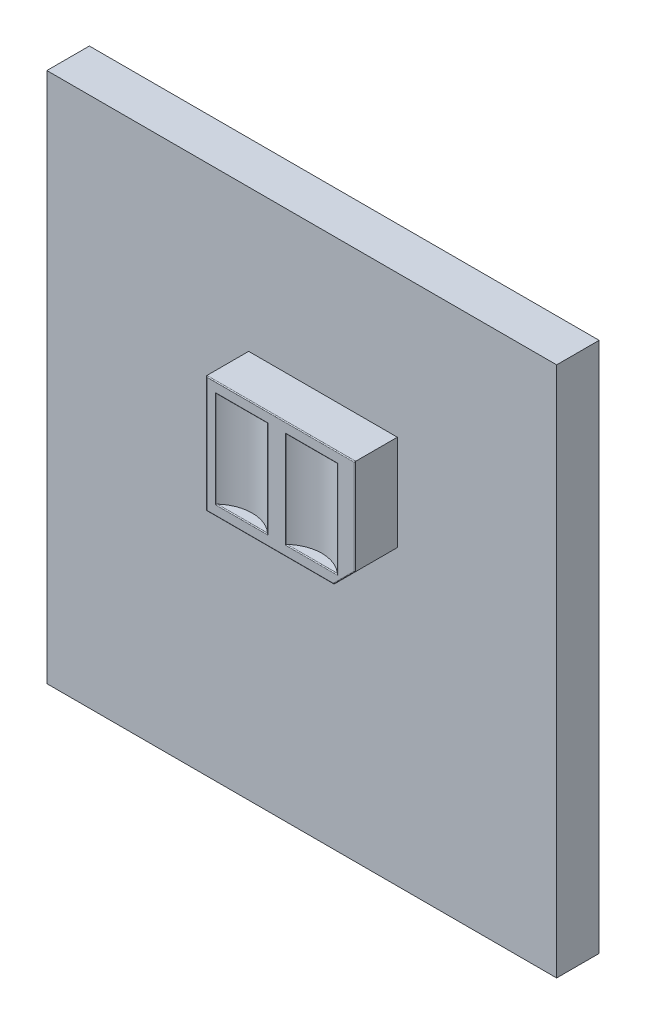
ISO-10303-21;
HEADER;
FILE_DESCRIPTION(('STEP AP214'),'2;1');
FILE_NAME('part.step','',(''),(''),'','','');
FILE_SCHEMA(('AUTOMOTIVE_DESIGN { 1 0 10303 214 1 1 1 1 }'));
ENDSEC;
DATA;
#1=APPLICATION_CONTEXT('core data for automotive mechanical design processes');
#2=APPLICATION_PROTOCOL_DEFINITION('international standard','automotive_design',2000,#1);
#3=PRODUCT_CONTEXT('',#1,'mechanical');
#4=PRODUCT('Part','Part','',(#3));
#5=PRODUCT_RELATED_PRODUCT_CATEGORY('part','',(#4));
#6=PRODUCT_DEFINITION_FORMATION('','',#4);
#7=PRODUCT_DEFINITION_CONTEXT('part definition',#1,'design');
#8=PRODUCT_DEFINITION('design','',#6,#7);
#9=PRODUCT_DEFINITION_SHAPE('','',#8);
#10=(LENGTH_UNIT() NAMED_UNIT(*) SI_UNIT(.MILLI.,.METRE.));
#11=(NAMED_UNIT(*) PLANE_ANGLE_UNIT() SI_UNIT($,.RADIAN.));
#12=(NAMED_UNIT(*) SI_UNIT($,.STERADIAN.) SOLID_ANGLE_UNIT());
#13=UNCERTAINTY_MEASURE_WITH_UNIT(LENGTH_MEASURE(1.E-05),#10,'distance_accuracy_value','');
#14=(GEOMETRIC_REPRESENTATION_CONTEXT(3) GLOBAL_UNCERTAINTY_ASSIGNED_CONTEXT((#13)) GLOBAL_UNIT_ASSIGNED_CONTEXT((#10,
#11,#12)) REPRESENTATION_CONTEXT('',''));
#15=CARTESIAN_POINT('',(0.,0.,0.));
#16=DIRECTION('',(0.,0.,1.));
#17=DIRECTION('',(1.,0.,0.));
#18=AXIS2_PLACEMENT_3D('',#15,#16,#17);
#19=CARTESIAN_POINT('',(-1.25,2.9,2.));
#20=DIRECTION('',(0.,0.,-1.));
#21=DIRECTION('',(-1.,0.,0.));
#22=AXIS2_PLACEMENT_3D('',#19,#20,#21);
#23=PLANE('',#22);
#24=DIRECTION('',(-1.,0.,0.));
#25=VECTOR('',#24,1.);
#26=CARTESIAN_POINT('',(-1.25,0.379999999999999,2.));
#27=LINE('',#26,#25);
#28=CARTESIAN_POINT('',(1.84761869429065,0.379999999999999,2.));
#29=VERTEX_POINT('',#28);
#30=CARTESIAN_POINT('',(0.611456137347775,0.379999999999999,2.));
#31=VERTEX_POINT('',#30);
#32=EDGE_CURVE('E288',#29,#31,#27,.T.);
#33=ORIENTED_EDGE('',*,*,#32,.T.);
#34=DIRECTION('',(0.,-1.,0.));
#35=VECTOR('',#34,1.);
#36=CARTESIAN_POINT('',(0.611456137347775,2.9,2.));
#37=LINE('',#36,#35);
#38=CARTESIAN_POINT('',(0.611456137347775,2.67,2.));
#39=VERTEX_POINT('',#38);
#40=EDGE_CURVE('E290',#31,#39,#37,.F.);
#41=ORIENTED_EDGE('',*,*,#40,.T.);
#42=DIRECTION('',(-1.,0.,0.));
#43=VECTOR('',#42,1.);
#44=CARTESIAN_POINT('',(1.83964288061938,2.67,2.));
#45=LINE('',#44,#43);
#46=CARTESIAN_POINT('',(1.84761869429065,2.67,2.));
#47=VERTEX_POINT('',#46);
#48=EDGE_CURVE('E284',#39,#47,#45,.F.);
#49=ORIENTED_EDGE('',*,*,#48,.T.);
#50=DIRECTION('',(0.,-1.,0.));
#51=VECTOR('',#50,1.);
#52=CARTESIAN_POINT('',(1.84761869429065,2.9,2.));
#53=LINE('',#52,#51);
#54=EDGE_CURVE('E286',#47,#29,#53,.T.);
#55=ORIENTED_EDGE('',*,*,#54,.T.);
#56=EDGE_LOOP('',(#33,#41,#49,#55));
#57=FACE_BOUND('',#56,.T.);
#58=DIRECTION('',(0.,1.,0.));
#59=VECTOR('',#58,1.);
#60=CARTESIAN_POINT('',(2.23,2.9,2.));
#61=LINE('',#60,#59);
#62=CARTESIAN_POINT('',(2.23,0.658284271247461,2.));
#63=VERTEX_POINT('',#62);
#64=CARTESIAN_POINT('',(2.23,2.88,2.));
#65=VERTEX_POINT('',#64);
#66=EDGE_CURVE('E279',#63,#65,#61,.T.);
#67=ORIENTED_EDGE('',*,*,#66,.T.);
#68=DIRECTION('',(-1.,0.,0.));
#69=VECTOR('',#68,1.);
#70=CARTESIAN_POINT('',(-1.25,2.88,2.));
#71=LINE('',#70,#69);
#72=CARTESIAN_POINT('',(-1.23,2.88,2.));
#73=VERTEX_POINT('',#72);
#74=EDGE_CURVE('E281',#65,#73,#71,.T.);
#75=ORIENTED_EDGE('',*,*,#74,.T.);
#76=DIRECTION('',(0.,-1.,0.));
#77=VECTOR('',#76,1.);
#78=CARTESIAN_POINT('',(-1.23,2.9,2.));
#79=LINE('',#78,#77);
#80=CARTESIAN_POINT('',(-1.23,0.169999999999999,2.));
#81=VERTEX_POINT('',#80);
#82=EDGE_CURVE('E273',#73,#81,#79,.T.);
#83=ORIENTED_EDGE('',*,*,#82,.T.);
#84=DIRECTION('',(1.,0.,0.));
#85=VECTOR('',#84,1.);
#86=CARTESIAN_POINT('',(-1.25,0.169999999999999,2.));
#87=LINE('',#86,#85);
#88=CARTESIAN_POINT('',(1.74171572875254,0.17,2.));
#89=VERTEX_POINT('',#88);
#90=EDGE_CURVE('E275',#81,#89,#87,.T.);
#91=ORIENTED_EDGE('',*,*,#90,.T.);
#92=DIRECTION('',(0.707106781186548,0.707106781186547,0.));
#93=VECTOR('',#92,1.);
#94=CARTESIAN_POINT('',(1.61085786437627,0.0391421356237291,2.));
#95=LINE('',#94,#93);
#96=EDGE_CURVE('E277',#89,#63,#95,.T.);
#97=ORIENTED_EDGE('',*,*,#96,.T.);
#98=EDGE_LOOP('',(#67,#75,#83,#91,#97));
#99=FACE_BOUND('',#98,.T.);
#100=DIRECTION('',(0.,-1.,0.));
#101=VECTOR('',#100,1.);
#102=CARTESIAN_POINT('',(0.205356341754182,2.9,2.));
#103=LINE('',#102,#101);
#104=CARTESIAN_POINT('',(0.205356341754182,2.67,2.));
#105=VERTEX_POINT('',#104);
#106=CARTESIAN_POINT('',(0.205356341754182,0.379999999999999,2.));
#107=VERTEX_POINT('',#106);
#108=EDGE_CURVE('E268',#105,#107,#103,.T.);
#109=ORIENTED_EDGE('',*,*,#108,.T.);
#110=DIRECTION('',(-1.,0.,0.));
#111=VECTOR('',#110,1.);
#112=CARTESIAN_POINT('',(-1.02283040151742,0.379999999999999,2.));
#113=LINE('',#112,#111);
#114=CARTESIAN_POINT('',(-1.03080621518869,0.379999999999999,2.));
#115=VERTEX_POINT('',#114);
#116=EDGE_CURVE('E270',#107,#115,#113,.T.);
#117=ORIENTED_EDGE('',*,*,#116,.T.);
#118=DIRECTION('',(0.,-1.,0.));
#119=VECTOR('',#118,1.);
#120=CARTESIAN_POINT('',(-1.03080621518869,2.9,2.));
#121=LINE('',#120,#119);
#122=CARTESIAN_POINT('',(-1.03080621518869,2.67,2.));
#123=VERTEX_POINT('',#122);
#124=EDGE_CURVE('E264',#115,#123,#121,.F.);
#125=ORIENTED_EDGE('',*,*,#124,.T.);
#126=DIRECTION('',(-1.,0.,0.));
#127=VECTOR('',#126,1.);
#128=CARTESIAN_POINT('',(-1.25,2.67,2.));
#129=LINE('',#128,#127);
#130=EDGE_CURVE('E266',#123,#105,#129,.F.);
#131=ORIENTED_EDGE('',*,*,#130,.T.);
#132=EDGE_LOOP('',(#109,#117,#125,#131));
#133=FACE_BOUND('',#132,.T.);
#134=ADVANCED_FACE('F33',(#57,#99,#133),#23,.F.);
#135=CARTESIAN_POINT('',(-6.,6.25,1.));
#136=DIRECTION('',(0.,0.,1.));
#137=DIRECTION('',(1.,0.,0.));
#138=AXIS2_PLACEMENT_3D('',#135,#136,#137);
#139=PLANE('',#138);
#140=DIRECTION('',(0.,-1.,0.));
#141=VECTOR('',#140,1.);
#142=CARTESIAN_POINT('',(-6.,6.25,1.));
#143=LINE('',#142,#141);
#144=CARTESIAN_POINT('',(-6.,6.25,1.));
#145=VERTEX_POINT('',#144);
#146=CARTESIAN_POINT('',(-6.,-6.25,1.));
#147=VERTEX_POINT('',#146);
#148=EDGE_CURVE('E239',#145,#147,#143,.T.);
#149=ORIENTED_EDGE('',*,*,#148,.T.);
#150=DIRECTION('',(1.,0.,0.));
#151=VECTOR('',#150,1.);
#152=CARTESIAN_POINT('',(-6.,-6.25,1.));
#153=LINE('',#152,#151);
#154=CARTESIAN_POINT('',(6.,-6.25,1.));
#155=VERTEX_POINT('',#154);
#156=EDGE_CURVE('E242',#147,#155,#153,.T.);
#157=ORIENTED_EDGE('',*,*,#156,.T.);
#158=DIRECTION('',(0.,1.,0.));
#159=VECTOR('',#158,1.);
#160=CARTESIAN_POINT('',(6.,6.25,1.));
#161=LINE('',#160,#159);
#162=CARTESIAN_POINT('',(6.,6.25,1.));
#163=VERTEX_POINT('',#162);
#164=EDGE_CURVE('E244',#155,#163,#161,.T.);
#165=ORIENTED_EDGE('',*,*,#164,.T.);
#166=DIRECTION('',(-1.,0.,0.));
#167=VECTOR('',#166,1.);
#168=CARTESIAN_POINT('',(-6.,6.25,1.));
#169=LINE('',#168,#167);
#170=EDGE_CURVE('E246',#163,#145,#169,.T.);
#171=ORIENTED_EDGE('',*,*,#170,.T.);
#172=EDGE_LOOP('',(#149,#157,#165,#171));
#173=FACE_BOUND('',#172,.T.);
#174=DIRECTION('',(-1.,0.,0.));
#175=VECTOR('',#174,1.);
#176=CARTESIAN_POINT('',(-6.,0.149999999999999,1.));
#177=LINE('',#176,#175);
#178=CARTESIAN_POINT('',(1.75,0.15,1.));
#179=VERTEX_POINT('',#178);
#180=CARTESIAN_POINT('',(-1.25,0.149999999999999,1.));
#181=VERTEX_POINT('',#180);
#182=EDGE_CURVE('E224',#179,#181,#177,.T.);
#183=ORIENTED_EDGE('',*,*,#182,.T.);
#184=DIRECTION('',(0.,1.,0.));
#185=VECTOR('',#184,1.);
#186=CARTESIAN_POINT('',(-1.25,6.25,1.));
#187=LINE('',#186,#185);
#188=CARTESIAN_POINT('',(-1.25,2.9,1.));
#189=VERTEX_POINT('',#188);
#190=EDGE_CURVE('E201',#181,#189,#187,.T.);
#191=ORIENTED_EDGE('',*,*,#190,.T.);
#192=DIRECTION('',(1.,0.,0.));
#193=VECTOR('',#192,1.);
#194=CARTESIAN_POINT('',(-6.,2.9,1.));
#195=LINE('',#194,#193);
#196=CARTESIAN_POINT('',(2.25,2.9,1.));
#197=VERTEX_POINT('',#196);
#198=EDGE_CURVE('E212',#189,#197,#195,.T.);
#199=ORIENTED_EDGE('',*,*,#198,.T.);
#200=DIRECTION('',(0.,-1.,0.));
#201=VECTOR('',#200,1.);
#202=CARTESIAN_POINT('',(2.25,6.25,1.));
#203=LINE('',#202,#201);
#204=CARTESIAN_POINT('',(2.25,0.65,1.));
#205=VERTEX_POINT('',#204);
#206=EDGE_CURVE('E218',#197,#205,#203,.T.);
#207=ORIENTED_EDGE('',*,*,#206,.T.);
#208=DIRECTION('',(-0.707106781186548,-0.707106781186547,0.));
#209=VECTOR('',#208,1.);
#210=CARTESIAN_POINT('',(0.925,-0.675000000000003,1.));
#211=LINE('',#210,#209);
#212=EDGE_CURVE('E230',#205,#179,#211,.T.);
#213=ORIENTED_EDGE('',*,*,#212,.T.);
#214=EDGE_LOOP('',(#183,#191,#199,#207,#213));
#215=FACE_BOUND('',#214,.T.);
#216=ADVANCED_FACE('F221',(#173,#215),#139,.T.);
#217=CARTESIAN_POINT('',(-6.,6.25,1.));
#218=DIRECTION('',(1.,0.,0.));
#219=DIRECTION('',(0.,1.,0.));
#220=AXIS2_PLACEMENT_3D('',#217,#218,#219);
#221=PLANE('',#220);
#222=DIRECTION('',(0.,-1.,0.));
#223=VECTOR('',#222,1.);
#224=CARTESIAN_POINT('',(-6.,6.25,0.));
#225=LINE('',#224,#223);
#226=CARTESIAN_POINT('',(-6.,6.25,0.));
#227=VERTEX_POINT('',#226);
#228=CARTESIAN_POINT('',(-6.,-6.25,0.));
#229=VERTEX_POINT('',#228);
#230=EDGE_CURVE('E225',#227,#229,#225,.T.);
#231=ORIENTED_EDGE('',*,*,#230,.T.);
#232=DIRECTION('',(0.,0.,-1.));
#233=VECTOR('',#232,1.);
#234=CARTESIAN_POINT('',(-6.,-6.25,1.));
#235=LINE('',#234,#233);
#236=EDGE_CURVE('E257',#147,#229,#235,.T.);
#237=ORIENTED_EDGE('',*,*,#236,.F.);
#238=ORIENTED_EDGE('',*,*,#148,.F.);
#239=DIRECTION('',(0.,0.,-1.));
#240=VECTOR('',#239,1.);
#241=CARTESIAN_POINT('',(-6.,6.25,1.));
#242=LINE('',#241,#240);
#243=EDGE_CURVE('E248',#145,#227,#242,.T.);
#244=ORIENTED_EDGE('',*,*,#243,.T.);
#245=EDGE_LOOP('',(#231,#237,#238,#244));
#246=FACE_BOUND('',#245,.T.);
#247=ADVANCED_FACE('F35',(#246),#221,.F.);
#248=CARTESIAN_POINT('',(-6.,-6.25,1.));
#249=DIRECTION('',(0.,1.,0.));
#250=DIRECTION('',(0.,0.,1.));
#251=AXIS2_PLACEMENT_3D('',#248,#249,#250);
#252=PLANE('',#251);
#253=DIRECTION('',(1.,0.,0.));
#254=VECTOR('',#253,1.);
#255=CARTESIAN_POINT('',(-6.,-6.25,0.));
#256=LINE('',#255,#254);
#257=CARTESIAN_POINT('',(6.,-6.25,0.));
#258=VERTEX_POINT('',#257);
#259=EDGE_CURVE('E228',#229,#258,#256,.T.);
#260=ORIENTED_EDGE('',*,*,#259,.T.);
#261=DIRECTION('',(0.,0.,-1.));
#262=VECTOR('',#261,1.);
#263=CARTESIAN_POINT('',(6.,-6.25,1.));
#264=LINE('',#263,#262);
#265=EDGE_CURVE('E254',#155,#258,#264,.T.);
#266=ORIENTED_EDGE('',*,*,#265,.F.);
#267=ORIENTED_EDGE('',*,*,#156,.F.);
#268=ORIENTED_EDGE('',*,*,#236,.T.);
#269=EDGE_LOOP('',(#260,#266,#267,#268));
#270=FACE_BOUND('',#269,.T.);
#271=ADVANCED_FACE('F726',(#270),#252,.F.);
#272=CARTESIAN_POINT('',(6.,6.25,1.));
#273=DIRECTION('',(-1.,0.,0.));
#274=DIRECTION('',(0.,0.,1.));
#275=AXIS2_PLACEMENT_3D('',#272,#273,#274);
#276=PLANE('',#275);
#277=DIRECTION('',(0.,1.,0.));
#278=VECTOR('',#277,1.);
#279=CARTESIAN_POINT('',(6.,6.25,0.));
#280=LINE('',#279,#278);
#281=CARTESIAN_POINT('',(6.,6.25,0.));
#282=VERTEX_POINT('',#281);
#283=EDGE_CURVE('E235',#258,#282,#280,.T.);
#284=ORIENTED_EDGE('',*,*,#283,.T.);
#285=DIRECTION('',(0.,0.,-1.));
#286=VECTOR('',#285,1.);
#287=CARTESIAN_POINT('',(6.,6.25,1.));
#288=LINE('',#287,#286);
#289=EDGE_CURVE('E251',#163,#282,#288,.T.);
#290=ORIENTED_EDGE('',*,*,#289,.F.);
#291=ORIENTED_EDGE('',*,*,#164,.F.);
#292=ORIENTED_EDGE('',*,*,#265,.T.);
#293=EDGE_LOOP('',(#284,#290,#291,#292));
#294=FACE_BOUND('',#293,.T.);
#295=ADVANCED_FACE('F717',(#294),#276,.F.);
#296=CARTESIAN_POINT('',(-6.,6.25,1.));
#297=DIRECTION('',(0.,-1.,0.));
#298=DIRECTION('',(1.,0.,0.));
#299=AXIS2_PLACEMENT_3D('',#296,#297,#298);
#300=PLANE('',#299);
#301=DIRECTION('',(-1.,0.,0.));
#302=VECTOR('',#301,1.);
#303=CARTESIAN_POINT('',(-6.,6.25,0.));
#304=LINE('',#303,#302);
#305=EDGE_CURVE('E237',#282,#227,#304,.T.);
#306=ORIENTED_EDGE('',*,*,#305,.T.);
#307=ORIENTED_EDGE('',*,*,#243,.F.);
#308=ORIENTED_EDGE('',*,*,#170,.F.);
#309=ORIENTED_EDGE('',*,*,#289,.T.);
#310=EDGE_LOOP('',(#306,#307,#308,#309));
#311=FACE_BOUND('',#310,.T.);
#312=ADVANCED_FACE('F709',(#311),#300,.F.);
#313=CARTESIAN_POINT('',(-6.,6.25,0.));
#314=DIRECTION('',(0.,0.,1.));
#315=DIRECTION('',(1.,0.,0.));
#316=AXIS2_PLACEMENT_3D('',#313,#314,#315);
#317=PLANE('',#316);
#318=ORIENTED_EDGE('',*,*,#230,.F.);
#319=ORIENTED_EDGE('',*,*,#305,.F.);
#320=ORIENTED_EDGE('',*,*,#283,.F.);
#321=ORIENTED_EDGE('',*,*,#259,.F.);
#322=EDGE_LOOP('',(#318,#319,#320,#321));
#323=FACE_BOUND('',#322,.T.);
#324=ADVANCED_FACE('F693',(#323),#317,.F.);
#325=CARTESIAN_POINT('',(-1.25,0.149999999999999,2.));
#326=DIRECTION('',(1.,0.,0.));
#327=DIRECTION('',(0.,0.,-1.));
#328=AXIS2_PLACEMENT_3D('',#325,#326,#327);
#329=PLANE('',#328);
#330=DIRECTION('',(0.,0.,-1.));
#331=VECTOR('',#330,1.);
#332=CARTESIAN_POINT('',(-1.25,0.149999999999999,2.));
#333=LINE('',#332,#331);
#334=CARTESIAN_POINT('',(-1.25,0.149999999999999,1.98));
#335=VERTEX_POINT('',#334);
#336=EDGE_CURVE('E219',#335,#181,#333,.T.);
#337=ORIENTED_EDGE('',*,*,#336,.F.);
#338=DIRECTION('',(0.,-1.,0.));
#339=VECTOR('',#338,1.);
#340=CARTESIAN_POINT('',(-1.25,0.149999999999999,1.98));
#341=LINE('',#340,#339);
#342=CARTESIAN_POINT('',(-1.25,2.9,1.98));
#343=VERTEX_POINT('',#342);
#344=EDGE_CURVE('E204',#335,#343,#341,.F.);
#345=ORIENTED_EDGE('',*,*,#344,.T.);
#346=DIRECTION('',(0.,0.,-1.));
#347=VECTOR('',#346,1.);
#348=CARTESIAN_POINT('',(-1.25,2.9,2.));
#349=LINE('',#348,#347);
#350=EDGE_CURVE('E196',#343,#189,#349,.T.);
#351=ORIENTED_EDGE('',*,*,#350,.T.);
#352=ORIENTED_EDGE('',*,*,#190,.F.);
#353=EDGE_LOOP('',(#337,#345,#351,#352));
#354=FACE_BOUND('',#353,.T.);
#355=ADVANCED_FACE('F199',(#354),#329,.F.);
#356=CARTESIAN_POINT('',(1.75,0.15,2.));
#357=DIRECTION('',(0.,1.,0.));
#358=DIRECTION('',(-1.,0.,0.));
#359=AXIS2_PLACEMENT_3D('',#356,#357,#358);
#360=PLANE('',#359);
#361=DIRECTION('',(0.,0.,-1.));
#362=VECTOR('',#361,1.);
#363=CARTESIAN_POINT('',(1.75,0.15,2.));
#364=LINE('',#363,#362);
#365=CARTESIAN_POINT('',(1.75,0.15,1.98));
#366=VERTEX_POINT('',#365);
#367=EDGE_CURVE('E450',#366,#179,#364,.T.);
#368=ORIENTED_EDGE('',*,*,#367,.F.);
#369=DIRECTION('',(1.,0.,0.));
#370=VECTOR('',#369,1.);
#371=CARTESIAN_POINT('',(1.75,0.15,1.98));
#372=LINE('',#371,#370);
#373=EDGE_CURVE('E303',#366,#335,#372,.F.);
#374=ORIENTED_EDGE('',*,*,#373,.T.);
#375=ORIENTED_EDGE('',*,*,#336,.T.);
#376=ORIENTED_EDGE('',*,*,#182,.F.);
#377=EDGE_LOOP('',(#368,#374,#375,#376));
#378=FACE_BOUND('',#377,.T.);
#379=ADVANCED_FACE('F461',(#378),#360,.F.);
#380=CARTESIAN_POINT('',(2.25,0.65,2.));
#381=DIRECTION('',(-0.707106781186547,0.707106781186548,0.));
#382=DIRECTION('',(-0.707106781186548,-0.707106781186547,0.));
#383=AXIS2_PLACEMENT_3D('',#380,#381,#382);
#384=PLANE('',#383);
#385=DIRECTION('',(0.,0.,-1.));
#386=VECTOR('',#385,1.);
#387=CARTESIAN_POINT('',(2.25,0.65,2.));
#388=LINE('',#387,#386);
#389=CARTESIAN_POINT('',(2.25,0.65,1.98));
#390=VERTEX_POINT('',#389);
#391=EDGE_CURVE('E448',#390,#205,#388,.T.);
#392=ORIENTED_EDGE('',*,*,#391,.F.);
#393=DIRECTION('',(0.707106781186548,0.707106781186547,0.));
#394=VECTOR('',#393,1.);
#395=CARTESIAN_POINT('',(2.25,0.65,1.98));
#396=LINE('',#395,#394);
#397=EDGE_CURVE('E301',#390,#366,#396,.F.);
#398=ORIENTED_EDGE('',*,*,#397,.T.);
#399=ORIENTED_EDGE('',*,*,#367,.T.);
#400=ORIENTED_EDGE('',*,*,#212,.F.);
#401=EDGE_LOOP('',(#392,#398,#399,#400));
#402=FACE_BOUND('',#401,.T.);
#403=ADVANCED_FACE('F456',(#402),#384,.F.);
#404=CARTESIAN_POINT('',(2.25,2.9,2.));
#405=DIRECTION('',(-1.,0.,0.));
#406=DIRECTION('',(0.,-1.,0.));
#407=AXIS2_PLACEMENT_3D('',#404,#405,#406);
#408=PLANE('',#407);
#409=DIRECTION('',(0.,0.,-1.));
#410=VECTOR('',#409,1.);
#411=CARTESIAN_POINT('',(2.25,2.9,2.));
#412=LINE('',#411,#410);
#413=CARTESIAN_POINT('',(2.25,2.9,1.98));
#414=VERTEX_POINT('',#413);
#415=EDGE_CURVE('E208',#414,#197,#412,.T.);
#416=ORIENTED_EDGE('',*,*,#415,.F.);
#417=DIRECTION('',(0.,1.,0.));
#418=VECTOR('',#417,1.);
#419=CARTESIAN_POINT('',(2.25,2.9,1.98));
#420=LINE('',#419,#418);
#421=EDGE_CURVE('E299',#414,#390,#420,.F.);
#422=ORIENTED_EDGE('',*,*,#421,.T.);
#423=ORIENTED_EDGE('',*,*,#391,.T.);
#424=ORIENTED_EDGE('',*,*,#206,.F.);
#425=EDGE_LOOP('',(#416,#422,#423,#424));
#426=FACE_BOUND('',#425,.T.);
#427=ADVANCED_FACE('F476',(#426),#408,.F.);
#428=CARTESIAN_POINT('',(-1.25,2.9,2.));
#429=DIRECTION('',(0.,-1.,0.));
#430=DIRECTION('',(1.,0.,0.));
#431=AXIS2_PLACEMENT_3D('',#428,#429,#430);
#432=PLANE('',#431);
#433=ORIENTED_EDGE('',*,*,#350,.F.);
#434=DIRECTION('',(-1.,0.,0.));
#435=VECTOR('',#434,1.);
#436=CARTESIAN_POINT('',(-1.25,2.9,1.98));
#437=LINE('',#436,#435);
#438=EDGE_CURVE('E297',#343,#414,#437,.F.);
#439=ORIENTED_EDGE('',*,*,#438,.T.);
#440=ORIENTED_EDGE('',*,*,#415,.T.);
#441=ORIENTED_EDGE('',*,*,#198,.F.);
#442=EDGE_LOOP('',(#433,#439,#440,#441));
#443=FACE_BOUND('',#442,.T.);
#444=ADVANCED_FACE('F213',(#443),#432,.F.);
#445=CARTESIAN_POINT('',(1.22953741581921,2.65,2.63752959298475));
#446=DIRECTION('',(0.,-1.,0.));
#447=DIRECTION('',(0.,0.,-1.));
#448=AXIS2_PLACEMENT_3D('',#445,#446,#447);
#449=CYLINDRICAL_SURFACE('',#448,0.882424308431226);
#450=CARTESIAN_POINT('',(1.22953741581921,2.65,2.63752959298475));
#451=DIRECTION('',(0.,-1.,0.));
#452=DIRECTION('',(0.,0.,-1.));
#453=AXIS2_PLACEMENT_3D('',#450,#451,#452);
#454=CIRCLE('',#453,0.882424308431226);
#455=CARTESIAN_POINT('',(0.641041456224215,2.65,1.98));
#456=VERTEX_POINT('',#455);
#457=CARTESIAN_POINT('',(1.81803337541421,2.65,1.98));
#458=VERTEX_POINT('',#457);
#459=EDGE_CURVE('E209',#456,#458,#454,.T.);
#460=ORIENTED_EDGE('',*,*,#459,.F.);
#461=CARTESIAN_POINT('',(0.64104145622431,2.65,1.97999999999991));
#462=CARTESIAN_POINT('',(0.639229264528936,2.65000463466067,1.98162119943892));
#463=CARTESIAN_POINT('',(0.637414844360353,2.65019827610663,1.98325934375454));
#464=CARTESIAN_POINT('',(0.633907770220435,2.65099829366424,1.98645110285114));
#465=CARTESIAN_POINT('',(0.632213091959319,2.65159196531503,1.98800577418609));
#466=CARTESIAN_POINT('',(0.629625775009194,2.65288558859772,1.99039714079993));
#467=CARTESIAN_POINT('',(0.628690729146444,2.65344060876203,1.99126539401268));
#468=CARTESIAN_POINT('',(0.626871950317172,2.65473048949529,1.99296106021629));
#469=CARTESIAN_POINT('',(0.625989471255889,2.65546845852036,1.99378743358304));
#470=CARTESIAN_POINT('',(0.625154378293915,2.65630175905386,1.9945725150534));
#471=B_SPLINE_CURVE_WITH_KNOTS('',3,(#461,#462,#463,#464,#465,#466,#467,#468,#469,#470),
.UNSPECIFIED.,.F.,.F.,(4,2,2,2,4),(0.,0.00730858401601803,0.0143953594583639,0.0185579599262931,
0.0227968207253998),.UNSPECIFIED.);
#472=CARTESIAN_POINT('',(0.625154378246137,2.65630175887519,1.99457251509831));
#473=VERTEX_POINT('',#472);
#474=EDGE_CURVE('E346',#456,#473,#471,.T.);
#475=ORIENTED_EDGE('',*,*,#474,.T.);
#476=DIRECTION('',(0.,-1.,0.));
#477=VECTOR('',#476,1.);
#478=CARTESIAN_POINT('',(0.625154378246137,2.65,1.99457251509831));
#479=LINE('',#478,#477);
#480=CARTESIAN_POINT('',(0.625154378246137,0.393698241124806,1.99457251509831));
#481=VERTEX_POINT('',#480);
#482=EDGE_CURVE('E262',#473,#481,#479,.T.);
#483=ORIENTED_EDGE('',*,*,#482,.T.);
#484=CARTESIAN_POINT('',(0.625154378246137,0.393698241124806,1.99457251509831));
#485=CARTESIAN_POINT('',(0.626170473442383,0.394710153132328,1.99361714979618));
#486=CARTESIAN_POINT('',(0.627254440869915,0.395582238017116,1.99260297294066));
#487=CARTESIAN_POINT('',(0.629494268254112,0.397058043741323,1.99051869911703));
#488=CARTESIAN_POINT('',(0.630648133038678,0.397667030227551,1.98945022993181));
#489=CARTESIAN_POINT('',(0.633287575989014,0.398785836079107,1.98702000571836));
#490=CARTESIAN_POINT('',(0.634787388046587,0.399238726169314,1.98564833132565));
#491=CARTESIAN_POINT('',(0.637870680751693,0.399848462956123,1.98284822149197));
#492=CARTESIAN_POINT('',(0.639455325591146,0.3999971294928,1.98141924599032));
#493=CARTESIAN_POINT('',(0.641041456223394,0.400000000002718,1.98000000000035));
#494=B_SPLINE_CURVE_WITH_KNOTS('',3,(#484,#485,#486,#487,#488,#489,#490,#491,#492,#493),
.UNSPECIFIED.,.F.,.F.,(4,2,2,2,4),(0.,0.00514761137983418,0.0101867987244266,0.0164101130178921,
0.022798675057217),.UNSPECIFIED.);
#495=CARTESIAN_POINT('',(0.641041456224215,0.399999999999999,1.98));
#496=VERTEX_POINT('',#495);
#497=EDGE_CURVE('E313',#481,#496,#494,.T.);
#498=ORIENTED_EDGE('',*,*,#497,.T.);
#499=CARTESIAN_POINT('',(1.22953741581921,0.399999999999999,2.63752959298475));
#500=DIRECTION('',(0.,-1.,0.));
#501=DIRECTION('',(0.,0.,-1.));
#502=AXIS2_PLACEMENT_3D('',#499,#500,#501);
#503=CIRCLE('',#502,0.882424308431226);
#504=CARTESIAN_POINT('',(1.81803337541421,0.399999999999999,1.98));
#505=VERTEX_POINT('',#504);
#506=EDGE_CURVE('E442',#496,#505,#503,.T.);
#507=ORIENTED_EDGE('',*,*,#506,.T.);
#508=CARTESIAN_POINT('',(1.81803337541421,0.399999999999999,1.98));
#509=CARTESIAN_POINT('',(1.81984556710958,0.399995365339325,1.981621199439));
#510=CARTESIAN_POINT('',(1.82165998727816,0.399801723893354,1.98325934375462));
#511=CARTESIAN_POINT('',(1.82516706141807,0.39900170633573,1.98645110285122));
#512=CARTESIAN_POINT('',(1.82686173967918,0.39840803468494,1.98800577418616));
#513=CARTESIAN_POINT('',(1.82944905662929,0.397114411402245,1.99039714079998));
#514=CARTESIAN_POINT('',(1.83038410249202,0.396559391237935,1.99126539401272));
#515=CARTESIAN_POINT('',(1.83220288132127,0.395269510504693,1.99296106021631));
#516=CARTESIAN_POINT('',(1.83308536038254,0.394531541479632,1.99378743358305));
#517=CARTESIAN_POINT('',(1.83392045334451,0.393698240946139,1.9945725150534));
#518=B_SPLINE_CURVE_WITH_KNOTS('',3,(#508,#509,#510,#511,#512,#513,#514,#515,#516,#517),
.UNSPECIFIED.,.F.,.F.,(4,2,2,2,4),(0.,0.00730858401600529,0.0143953594583403,0.0185579599262182,
0.0227968207252717),.UNSPECIFIED.);
#519=CARTESIAN_POINT('',(1.83392045339228,0.393698241124806,1.99457251509831));
#520=VERTEX_POINT('',#519);
#521=EDGE_CURVE('E320',#505,#520,#518,.T.);
#522=ORIENTED_EDGE('',*,*,#521,.T.);
#523=DIRECTION('',(0.,-1.,0.));
#524=VECTOR('',#523,1.);
#525=CARTESIAN_POINT('',(1.83392045339228,2.65,1.99457251509831));
#526=LINE('',#525,#524);
#527=CARTESIAN_POINT('',(1.83392045339228,2.65630175887519,1.99457251509831));
#528=VERTEX_POINT('',#527);
#529=EDGE_CURVE('E260',#520,#528,#526,.F.);
#530=ORIENTED_EDGE('',*,*,#529,.T.);
#531=CARTESIAN_POINT('',(1.83392045339228,2.65630175887519,1.99457251509831));
#532=CARTESIAN_POINT('',(1.83290435819604,2.65528984686767,1.99361714979618));
#533=CARTESIAN_POINT('',(1.83182039076851,2.65441776198288,1.99260297294066));
#534=CARTESIAN_POINT('',(1.82958056338431,2.65294195625868,1.99051869911703));
#535=CARTESIAN_POINT('',(1.82842669859974,2.65233296977245,1.98945022993181));
#536=CARTESIAN_POINT('',(1.82578725564941,2.65121416392089,1.98702000571836));
#537=CARTESIAN_POINT('',(1.82428744359184,2.65076127383068,1.98564833132565));
#538=CARTESIAN_POINT('',(1.82120415088673,2.65015153704388,1.98284822149197));
#539=CARTESIAN_POINT('',(1.81961950604728,2.6500028705072,1.98141924599033));
#540=CARTESIAN_POINT('',(1.81803337541503,2.64999999999728,1.98000000000036));
#541=B_SPLINE_CURVE_WITH_KNOTS('',3,(#531,#532,#533,#534,#535,#536,#537,#538,#539,#540),
.UNSPECIFIED.,.F.,.F.,(4,2,2,2,4),(0.,0.00514761137983418,0.0101867987244264,0.0164101130178889,
0.0227986750572116),.UNSPECIFIED.);
#542=EDGE_CURVE('E351',#528,#458,#541,.T.);
#543=ORIENTED_EDGE('',*,*,#542,.T.);
#544=EDGE_LOOP('',(#460,#475,#483,#498,#507,#522,#530,#543));
#545=FACE_BOUND('',#544,.T.);
#546=ADVANCED_FACE('F325',(#545),#449,.F.);
#547=CARTESIAN_POINT('',(1.22953741581921,2.65,2.63752959298475));
#548=DIRECTION('',(0.,-1.,0.));
#549=DIRECTION('',(0.,0.,-1.));
#550=AXIS2_PLACEMENT_3D('',#547,#548,#549);
#551=PLANE('',#550);
#552=ORIENTED_EDGE('',*,*,#459,.T.);
#553=DIRECTION('',(-1.,0.,0.));
#554=VECTOR('',#553,1.);
#555=CARTESIAN_POINT('',(0.619431951019045,2.65,1.98));
#556=LINE('',#555,#554);
#557=EDGE_CURVE('E295',#458,#456,#556,.T.);
#558=ORIENTED_EDGE('',*,*,#557,.T.);
#559=EDGE_LOOP('',(#552,#558));
#560=FACE_BOUND('',#559,.T.);
#561=ADVANCED_FACE('F504',(#560),#551,.T.);
#562=CARTESIAN_POINT('',(1.22953741581921,0.399999999999999,2.63752959298475));
#563=DIRECTION('',(0.,-1.,0.));
#564=DIRECTION('',(0.,0.,-1.));
#565=AXIS2_PLACEMENT_3D('',#562,#563,#564);
#566=PLANE('',#565);
#567=ORIENTED_EDGE('',*,*,#506,.F.);
#568=DIRECTION('',(-1.,0.,0.));
#569=VECTOR('',#568,1.);
#570=CARTESIAN_POINT('',(1.22953741581921,0.399999999999999,1.98));
#571=LINE('',#570,#569);
#572=EDGE_CURVE('E293',#496,#505,#571,.F.);
#573=ORIENTED_EDGE('',*,*,#572,.T.);
#574=EDGE_LOOP('',(#567,#573));
#575=FACE_BOUND('',#574,.T.);
#576=ADVANCED_FACE('F500',(#575),#566,.F.);
#577=CARTESIAN_POINT('',(-0.412724936717254,2.65,2.63752959298475));
#578=DIRECTION('',(0.,-1.,0.));
#579=DIRECTION('',(0.,0.,-1.));
#580=AXIS2_PLACEMENT_3D('',#577,#578,#579);
#581=CYLINDRICAL_SURFACE('',#580,0.882424308431226);
#582=CARTESIAN_POINT('',(0.175771022877743,0.399999999999999,1.98));
#583=CARTESIAN_POINT('',(0.177583214573113,0.399995365339325,1.981621199439));
#584=CARTESIAN_POINT('',(0.179397634741693,0.399801723893354,1.98325934375462));
#585=CARTESIAN_POINT('',(0.182904708881604,0.39900170633573,1.98645110285122));
#586=CARTESIAN_POINT('',(0.184599387142716,0.398408034684939,1.98800577418616));
#587=CARTESIAN_POINT('',(0.187186704092822,0.397114411402245,1.99039714079998));
#588=CARTESIAN_POINT('',(0.188121749955559,0.396559391237934,1.99126539401272));
#589=CARTESIAN_POINT('',(0.189940528784807,0.395269510504693,1.99296106021631));
#590=CARTESIAN_POINT('',(0.190823007846079,0.394531541479632,1.99378743358305));
#591=CARTESIAN_POINT('',(0.191658100808043,0.393698240946139,1.9945725150534));
#592=B_SPLINE_CURVE_WITH_KNOTS('',3,(#582,#583,#584,#585,#586,#587,#588,#589,#590,#591),
.UNSPECIFIED.,.F.,.F.,(4,2,2,2,4),(0.,0.00730858401600579,0.0143953594583402,0.0185579599262177,
0.022796820725271),.UNSPECIFIED.);
#593=CARTESIAN_POINT('',(0.175771022877742,0.399999999999999,1.98));
#594=VERTEX_POINT('',#593);
#595=CARTESIAN_POINT('',(0.19165810085582,0.393698241124806,1.99457251509831));
#596=VERTEX_POINT('',#595);
#597=EDGE_CURVE('E362',#594,#596,#592,.T.);
#598=ORIENTED_EDGE('',*,*,#597,.T.);
#599=DIRECTION('',(0.,-1.,0.));
#600=VECTOR('',#599,1.);
#601=CARTESIAN_POINT('',(0.19165810085582,2.65,1.99457251509831));
#602=LINE('',#601,#600);
#603=CARTESIAN_POINT('',(0.19165810085582,2.65630175887519,1.99457251509831));
#604=VERTEX_POINT('',#603);
#605=EDGE_CURVE('E60',#596,#604,#602,.F.);
#606=ORIENTED_EDGE('',*,*,#605,.T.);
#607=CARTESIAN_POINT('',(0.19165810085582,2.65630175887519,1.99457251509831));
#608=CARTESIAN_POINT('',(0.190642005659574,2.65528984686767,1.99361714979618));
#609=CARTESIAN_POINT('',(0.189558038232042,2.65441776198288,1.99260297294066));
#610=CARTESIAN_POINT('',(0.187318210847845,2.65294195625868,1.99051869911703));
#611=CARTESIAN_POINT('',(0.186164346063279,2.65233296977245,1.98945022993181));
#612=CARTESIAN_POINT('',(0.183524903112944,2.65121416392089,1.98702000571836));
#613=CARTESIAN_POINT('',(0.182025091055371,2.65076127383068,1.98564833132565));
#614=CARTESIAN_POINT('',(0.178941798350266,2.65015153704388,1.98284822149197));
#615=CARTESIAN_POINT('',(0.177357153510814,2.6500028705072,1.98141924599033));
#616=CARTESIAN_POINT('',(0.175771022878567,2.64999999999728,1.98000000000036));
#617=B_SPLINE_CURVE_WITH_KNOTS('',3,(#607,#608,#609,#610,#611,#612,#613,#614,#615,#616),
.UNSPECIFIED.,.F.,.F.,(4,2,2,2,4),(0.,0.00514761137983428,0.0101867987244264,0.0164101130178899,
0.0227986750572122),.UNSPECIFIED.);
#618=CARTESIAN_POINT('',(0.175771022877742,2.65,1.98));
#619=VERTEX_POINT('',#618);
#620=EDGE_CURVE('E11',#604,#619,#617,.T.);
#621=ORIENTED_EDGE('',*,*,#620,.T.);
#622=CARTESIAN_POINT('',(-0.412724936717254,2.65,2.63752959298475));
#623=DIRECTION('',(0.,-1.,0.));
#624=DIRECTION('',(0.,0.,1.));
#625=AXIS2_PLACEMENT_3D('',#622,#623,#624);
#626=CIRCLE('',#625,0.882424308431226);
#627=CARTESIAN_POINT('',(-1.00122089631225,2.65,1.98));
#628=VERTEX_POINT('',#627);
#629=EDGE_CURVE('E439',#628,#619,#626,.T.);
#630=ORIENTED_EDGE('',*,*,#629,.F.);
#631=CARTESIAN_POINT('',(-1.00122089631215,2.65,1.97999999999991));
#632=CARTESIAN_POINT('',(-1.00303308800753,2.65000463466067,1.98162119943892));
#633=CARTESIAN_POINT('',(-1.00484750817611,2.65019827610663,1.98325934375454));
#634=CARTESIAN_POINT('',(-1.00835458231603,2.65099829366424,1.98645110285115));
#635=CARTESIAN_POINT('',(-1.01004926057715,2.65159196531503,1.98800577418609));
#636=CARTESIAN_POINT('',(-1.01263657752727,2.65288558859772,1.99039714079993));
#637=CARTESIAN_POINT('',(-1.01357162339002,2.65344060876203,1.99126539401268));
#638=CARTESIAN_POINT('',(-1.01539040221929,2.65473048949529,1.99296106021629));
#639=CARTESIAN_POINT('',(-1.01627288128058,2.65546845852036,1.99378743358304));
#640=CARTESIAN_POINT('',(-1.01710797424255,2.65630175905386,1.9945725150534));
#641=B_SPLINE_CURVE_WITH_KNOTS('',3,(#631,#632,#633,#634,#635,#636,#637,#638,#639,#640),
.UNSPECIFIED.,.F.,.F.,(4,2,2,2,4),(0.,0.00730858401601856,0.0143953594583648,0.0185579599262939,
0.0227968207253995),.UNSPECIFIED.);
#642=CARTESIAN_POINT('',(-1.01710797429033,2.65630175887519,1.99457251509831));
#643=VERTEX_POINT('',#642);
#644=EDGE_CURVE('E46',#628,#643,#641,.T.);
#645=ORIENTED_EDGE('',*,*,#644,.T.);
#646=DIRECTION('',(0.,-1.,0.));
#647=VECTOR('',#646,1.);
#648=CARTESIAN_POINT('',(-1.01710797429033,2.65,1.99457251509831));
#649=LINE('',#648,#647);
#650=CARTESIAN_POINT('',(-1.01710797429033,0.393698241124806,1.99457251509831));
#651=VERTEX_POINT('',#650);
#652=EDGE_CURVE('E53',#643,#651,#649,.T.);
#653=ORIENTED_EDGE('',*,*,#652,.T.);
#654=CARTESIAN_POINT('',(-1.01710797429033,0.393698241124806,1.99457251509831));
#655=CARTESIAN_POINT('',(-1.01609187909408,0.394710153132328,1.99361714979618));
#656=CARTESIAN_POINT('',(-1.01500791166655,0.395582238017116,1.99260297294066));
#657=CARTESIAN_POINT('',(-1.01276808428235,0.397058043741323,1.99051869911703));
#658=CARTESIAN_POINT('',(-1.01161421949779,0.397667030227551,1.98945022993181));
#659=CARTESIAN_POINT('',(-1.00897477654745,0.398785836079107,1.98702000571836));
#660=CARTESIAN_POINT('',(-1.00747496448988,0.399238726169315,1.98564833132565));
#661=CARTESIAN_POINT('',(-1.00439167178477,0.399848462956123,1.98284822149197));
#662=CARTESIAN_POINT('',(-1.00280702694532,0.3999971294928,1.98141924599032));
#663=CARTESIAN_POINT('',(-1.00122089631307,0.400000000002718,1.98000000000035));
#664=B_SPLINE_CURVE_WITH_KNOTS('',3,(#654,#655,#656,#657,#658,#659,#660,#661,#662,#663),
.UNSPECIFIED.,.F.,.F.,(4,2,2,2,4),(0.,0.00514761137983423,0.0101867987244265,0.0164101130178923,
0.0227986750572177),.UNSPECIFIED.);
#665=CARTESIAN_POINT('',(-1.00122089631225,0.399999999999999,1.98));
#666=VERTEX_POINT('',#665);
#667=EDGE_CURVE('E356',#651,#666,#664,.T.);
#668=ORIENTED_EDGE('',*,*,#667,.T.);
#669=CARTESIAN_POINT('',(-0.412724936717254,0.399999999999999,2.63752959298475));
#670=DIRECTION('',(0.,-1.,0.));
#671=DIRECTION('',(0.,0.,1.));
#672=AXIS2_PLACEMENT_3D('',#669,#670,#671);
#673=CIRCLE('',#672,0.882424308431226);
#674=EDGE_CURVE('E399',#666,#594,#673,.T.);
#675=ORIENTED_EDGE('',*,*,#674,.T.);
#676=EDGE_LOOP('',(#598,#606,#621,#630,#645,#653,#668,#675));
#677=FACE_BOUND('',#676,.T.);
#678=ADVANCED_FACE('F366',(#677),#581,.F.);
#679=CARTESIAN_POINT('',(-0.412724936717254,2.65,2.63752959298475));
#680=DIRECTION('',(0.,1.,0.));
#681=DIRECTION('',(0.,0.,1.));
#682=AXIS2_PLACEMENT_3D('',#679,#680,#681);
#683=PLANE('',#682);
#684=ORIENTED_EDGE('',*,*,#629,.T.);
#685=DIRECTION('',(-1.,0.,0.));
#686=VECTOR('',#685,1.);
#687=CARTESIAN_POINT('',(-0.412724936717254,2.65,1.98));
#688=LINE('',#687,#686);
#689=EDGE_CURVE('E311',#619,#628,#688,.T.);
#690=ORIENTED_EDGE('',*,*,#689,.T.);
#691=EDGE_LOOP('',(#684,#690));
#692=FACE_BOUND('',#691,.T.);
#693=ADVANCED_FACE('F492',(#692),#683,.F.);
#694=CARTESIAN_POINT('',(-0.412724936717254,0.399999999999999,2.63752959298475));
#695=DIRECTION('',(0.,1.,0.));
#696=DIRECTION('',(0.,0.,1.));
#697=AXIS2_PLACEMENT_3D('',#694,#695,#696);
#698=PLANE('',#697);
#699=ORIENTED_EDGE('',*,*,#674,.F.);
#700=DIRECTION('',(-1.,0.,0.));
#701=VECTOR('',#700,1.);
#702=CARTESIAN_POINT('',(0.197380528082912,0.399999999999999,1.98));
#703=LINE('',#702,#701);
#704=EDGE_CURVE('E306',#666,#594,#703,.F.);
#705=ORIENTED_EDGE('',*,*,#704,.T.);
#706=EDGE_LOOP('',(#699,#705));
#707=FACE_BOUND('',#706,.T.);
#708=ADVANCED_FACE('F494',(#707),#698,.T.);
#709=CARTESIAN_POINT('',(1.84761869429065,2.65,1.98));
#710=DIRECTION('',(0.,-1.,0.));
#711=DIRECTION('',(0.,0.,-1.));
#712=AXIS2_PLACEMENT_3D('',#709,#710,#711);
#713=CYLINDRICAL_SURFACE('',#712,0.02);
#714=CARTESIAN_POINT('',(1.84761869429065,0.379999999999999,1.98));
#715=DIRECTION('',(-0.707106781186547,-0.707106781186547,0.));
#716=DIRECTION('',(-0.707106781186547,0.707106781186547,0.));
#717=AXIS2_PLACEMENT_3D('',#714,#715,#716);
#718=ELLIPSE('',#717,0.0282842712474619,0.02);
#719=EDGE_CURVE('E432',#29,#520,#718,.T.);
#720=ORIENTED_EDGE('',*,*,#719,.F.);
#721=ORIENTED_EDGE('',*,*,#54,.F.);
#722=CARTESIAN_POINT('',(1.84761869429065,2.67,1.98));
#723=DIRECTION('',(0.707106781186547,-0.707106781186547,0.));
#724=DIRECTION('',(-0.707106781186547,-0.707106781186547,0.));
#725=AXIS2_PLACEMENT_3D('',#722,#723,#724);
#726=ELLIPSE('',#725,0.0282842712474619,0.02);
#727=EDGE_CURVE('E435',#528,#47,#726,.F.);
#728=ORIENTED_EDGE('',*,*,#727,.F.);
#729=ORIENTED_EDGE('',*,*,#529,.F.);
#730=EDGE_LOOP('',(#720,#721,#728,#729));
#731=FACE_BOUND('',#730,.T.);
#732=ADVANCED_FACE('F342',(#731),#713,.T.);
#733=CARTESIAN_POINT('',(1.22953741581921,2.67,1.98));
#734=DIRECTION('',(1.,0.,0.));
#735=DIRECTION('',(0.,0.,-1.));
#736=AXIS2_PLACEMENT_3D('',#733,#734,#735);
#737=CYLINDRICAL_SURFACE('',#736,0.02);
#738=ORIENTED_EDGE('',*,*,#727,.T.);
#739=ORIENTED_EDGE('',*,*,#48,.F.);
#740=CARTESIAN_POINT('',(0.611456137347775,2.67,1.98));
#741=DIRECTION('',(-0.707106781186547,-0.707106781186547,0.));
#742=DIRECTION('',(0.707106781186547,-0.707106781186547,0.));
#743=AXIS2_PLACEMENT_3D('',#740,#741,#742);
#744=ELLIPSE('',#743,0.0282842712474619,0.02);
#745=EDGE_CURVE('E430',#473,#39,#744,.T.);
#746=ORIENTED_EDGE('',*,*,#745,.F.);
#747=ORIENTED_EDGE('',*,*,#474,.F.);
#748=ORIENTED_EDGE('',*,*,#557,.F.);
#749=ORIENTED_EDGE('',*,*,#542,.F.);
#750=EDGE_LOOP('',(#738,#739,#746,#747,#748,#749));
#751=FACE_BOUND('',#750,.T.);
#752=ADVANCED_FACE('F335',(#751),#737,.T.);
#753=CARTESIAN_POINT('',(-1.25,0.379999999999999,1.98));
#754=DIRECTION('',(-1.,0.,0.));
#755=DIRECTION('',(0.,0.,1.));
#756=AXIS2_PLACEMENT_3D('',#753,#754,#755);
#757=CYLINDRICAL_SURFACE('',#756,0.02);
#758=ORIENTED_EDGE('',*,*,#572,.F.);
#759=ORIENTED_EDGE('',*,*,#497,.F.);
#760=CARTESIAN_POINT('',(0.611456137347775,0.379999999999999,1.98));
#761=DIRECTION('',(0.707106781186547,-0.707106781186547,0.));
#762=DIRECTION('',(-0.707106781186547,-0.707106781186547,0.));
#763=AXIS2_PLACEMENT_3D('',#760,#761,#762);
#764=ELLIPSE('',#763,0.0282842712474619,0.02);
#765=EDGE_CURVE('E427',#31,#481,#764,.F.);
#766=ORIENTED_EDGE('',*,*,#765,.F.);
#767=ORIENTED_EDGE('',*,*,#32,.F.);
#768=ORIENTED_EDGE('',*,*,#719,.T.);
#769=ORIENTED_EDGE('',*,*,#521,.F.);
#770=EDGE_LOOP('',(#758,#759,#766,#767,#768,#769));
#771=FACE_BOUND('',#770,.T.);
#772=ADVANCED_FACE('F329',(#771),#757,.T.);
#773=CARTESIAN_POINT('',(0.611456137347775,2.65,1.98));
#774=DIRECTION('',(0.,-1.,0.));
#775=DIRECTION('',(0.,0.,-1.));
#776=AXIS2_PLACEMENT_3D('',#773,#774,#775);
#777=CYLINDRICAL_SURFACE('',#776,0.02);
#778=ORIENTED_EDGE('',*,*,#745,.T.);
#779=ORIENTED_EDGE('',*,*,#40,.F.);
#780=ORIENTED_EDGE('',*,*,#765,.T.);
#781=ORIENTED_EDGE('',*,*,#482,.F.);
#782=EDGE_LOOP('',(#778,#779,#780,#781));
#783=FACE_BOUND('',#782,.T.);
#784=ADVANCED_FACE('F334',(#783),#777,.T.);
#785=CARTESIAN_POINT('',(1.61085786437627,0.0391421356237295,1.98));
#786=DIRECTION('',(0.707106781186548,0.707106781186547,0.));
#787=DIRECTION('',(-0.707106781186547,0.707106781186548,0.));
#788=AXIS2_PLACEMENT_3D('',#785,#786,#787);
#789=CYLINDRICAL_SURFACE('',#788,0.02);
#790=CARTESIAN_POINT('',(2.23,0.658284271247461,1.98));
#791=DIRECTION('',(0.38268343236509,0.923879532511287,0.));
#792=DIRECTION('',(0.923879532511287,-0.38268343236509,0.));
#793=AXIS2_PLACEMENT_3D('',#790,#791,#792);
#794=ELLIPSE('',#793,0.0216478440058479,0.02);
#795=EDGE_CURVE('E421',#63,#390,#794,.T.);
#796=ORIENTED_EDGE('',*,*,#795,.F.);
#797=ORIENTED_EDGE('',*,*,#96,.F.);
#798=CARTESIAN_POINT('',(1.74171572875254,0.169999999999999,1.98));
#799=DIRECTION('',(0.923879532511287,0.38268343236509,0.));
#800=DIRECTION('',(0.38268343236509,-0.923879532511287,0.));
#801=AXIS2_PLACEMENT_3D('',#798,#799,#800);
#802=ELLIPSE('',#801,0.0216478440058479,0.02);
#803=EDGE_CURVE('E424',#366,#89,#802,.F.);
#804=ORIENTED_EDGE('',*,*,#803,.F.);
#805=ORIENTED_EDGE('',*,*,#397,.F.);
#806=EDGE_LOOP('',(#796,#797,#804,#805));
#807=FACE_BOUND('',#806,.T.);
#808=ADVANCED_FACE('F483',(#807),#789,.T.);
#809=CARTESIAN_POINT('',(-1.25,0.169999999999999,1.98));
#810=DIRECTION('',(1.,0.,0.));
#811=DIRECTION('',(0.,1.,0.));
#812=AXIS2_PLACEMENT_3D('',#809,#810,#811);
#813=CYLINDRICAL_SURFACE('',#812,0.02);
#814=ORIENTED_EDGE('',*,*,#803,.T.);
#815=ORIENTED_EDGE('',*,*,#90,.F.);
#816=CARTESIAN_POINT('',(-1.23,0.169999999999999,1.98));
#817=DIRECTION('',(0.707106781186548,-0.707106781186547,0.));
#818=DIRECTION('',(-0.707106781186547,-0.707106781186548,0.));
#819=AXIS2_PLACEMENT_3D('',#816,#817,#818);
#820=ELLIPSE('',#819,0.0282842712474619,0.02);
#821=EDGE_CURVE('E418',#335,#81,#820,.F.);
#822=ORIENTED_EDGE('',*,*,#821,.F.);
#823=ORIENTED_EDGE('',*,*,#373,.F.);
#824=EDGE_LOOP('',(#814,#815,#822,#823));
#825=FACE_BOUND('',#824,.T.);
#826=ADVANCED_FACE('F466',(#825),#813,.T.);
#827=CARTESIAN_POINT('',(2.23,2.9,1.98));
#828=DIRECTION('',(0.,1.,0.));
#829=DIRECTION('',(-1.,0.,0.));
#830=AXIS2_PLACEMENT_3D('',#827,#828,#829);
#831=CYLINDRICAL_SURFACE('',#830,0.02);
#832=ORIENTED_EDGE('',*,*,#795,.T.);
#833=ORIENTED_EDGE('',*,*,#421,.F.);
#834=CARTESIAN_POINT('',(2.23,2.88,1.98));
#835=DIRECTION('',(-0.707106781186548,0.707106781186547,0.));
#836=DIRECTION('',(0.707106781186547,0.707106781186548,0.));
#837=AXIS2_PLACEMENT_3D('',#834,#835,#836);
#838=ELLIPSE('',#837,0.0282842712474619,0.02);
#839=EDGE_CURVE('E416',#65,#414,#838,.T.);
#840=ORIENTED_EDGE('',*,*,#839,.F.);
#841=ORIENTED_EDGE('',*,*,#66,.F.);
#842=EDGE_LOOP('',(#832,#833,#840,#841));
#843=FACE_BOUND('',#842,.T.);
#844=ADVANCED_FACE('F478',(#843),#831,.T.);
#845=CARTESIAN_POINT('',(-1.23,2.9,1.98));
#846=DIRECTION('',(0.,-1.,0.));
#847=DIRECTION('',(0.,0.,-1.));
#848=AXIS2_PLACEMENT_3D('',#845,#846,#847);
#849=CYLINDRICAL_SURFACE('',#848,0.02);
#850=ORIENTED_EDGE('',*,*,#821,.T.);
#851=ORIENTED_EDGE('',*,*,#82,.F.);
#852=CARTESIAN_POINT('',(-1.23,2.88,1.98));
#853=DIRECTION('',(-0.707106781186547,-0.707106781186548,0.));
#854=DIRECTION('',(0.707106781186548,-0.707106781186547,0.));
#855=AXIS2_PLACEMENT_3D('',#852,#853,#854);
#856=ELLIPSE('',#855,0.0282842712474619,0.02);
#857=EDGE_CURVE('E414',#343,#73,#856,.F.);
#858=ORIENTED_EDGE('',*,*,#857,.F.);
#859=ORIENTED_EDGE('',*,*,#344,.F.);
#860=EDGE_LOOP('',(#850,#851,#858,#859));
#861=FACE_BOUND('',#860,.T.);
#862=ADVANCED_FACE('F470',(#861),#849,.T.);
#863=CARTESIAN_POINT('',(-1.25,2.88,1.98));
#864=DIRECTION('',(-1.,0.,0.));
#865=DIRECTION('',(0.,-1.,0.));
#866=AXIS2_PLACEMENT_3D('',#863,#864,#865);
#867=CYLINDRICAL_SURFACE('',#866,0.02);
#868=ORIENTED_EDGE('',*,*,#839,.T.);
#869=ORIENTED_EDGE('',*,*,#438,.F.);
#870=ORIENTED_EDGE('',*,*,#857,.T.);
#871=ORIENTED_EDGE('',*,*,#74,.F.);
#872=EDGE_LOOP('',(#868,#869,#870,#871));
#873=FACE_BOUND('',#872,.T.);
#874=ADVANCED_FACE('F386',(#873),#867,.T.);
#875=CARTESIAN_POINT('',(-0.412724936717254,2.67,1.98));
#876=DIRECTION('',(-1.,0.,0.));
#877=DIRECTION('',(0.,0.,1.));
#878=AXIS2_PLACEMENT_3D('',#875,#876,#877);
#879=CYLINDRICAL_SURFACE('',#878,0.02);
#880=ORIENTED_EDGE('',*,*,#689,.F.);
#881=ORIENTED_EDGE('',*,*,#620,.F.);
#882=CARTESIAN_POINT('',(0.205356341754182,2.67,1.98));
#883=DIRECTION('',(0.707106781186547,-0.707106781186547,0.));
#884=DIRECTION('',(-0.707106781186547,-0.707106781186547,0.));
#885=AXIS2_PLACEMENT_3D('',#882,#883,#884);
#886=ELLIPSE('',#885,0.0282842712474619,0.02);
#887=EDGE_CURVE('E408',#105,#604,#886,.T.);
#888=ORIENTED_EDGE('',*,*,#887,.F.);
#889=ORIENTED_EDGE('',*,*,#130,.F.);
#890=CARTESIAN_POINT('',(-1.03080621518869,2.67,1.98));
#891=DIRECTION('',(-0.707106781186547,-0.707106781186547,0.));
#892=DIRECTION('',(-0.707106781186547,0.707106781186547,0.));
#893=AXIS2_PLACEMENT_3D('',#890,#891,#892);
#894=ELLIPSE('',#893,0.0282842712474619,0.02);
#895=EDGE_CURVE('E405',#643,#123,#894,.T.);
#896=ORIENTED_EDGE('',*,*,#895,.F.);
#897=ORIENTED_EDGE('',*,*,#644,.F.);
#898=EDGE_LOOP('',(#880,#881,#888,#889,#896,#897));
#899=FACE_BOUND('',#898,.T.);
#900=ADVANCED_FACE('F381',(#899),#879,.T.);
#901=CARTESIAN_POINT('',(0.205356341754182,2.65,1.98));
#902=DIRECTION('',(0.,-1.,0.));
#903=DIRECTION('',(0.,0.,-1.));
#904=AXIS2_PLACEMENT_3D('',#901,#902,#903);
#905=CYLINDRICAL_SURFACE('',#904,0.02);
#906=ORIENTED_EDGE('',*,*,#605,.F.);
#907=CARTESIAN_POINT('',(0.205356341754182,0.379999999999999,1.98));
#908=DIRECTION('',(0.707106781186547,0.707106781186547,0.));
#909=DIRECTION('',(0.707106781186547,-0.707106781186547,0.));
#910=AXIS2_PLACEMENT_3D('',#907,#908,#909);
#911=ELLIPSE('',#910,0.0282842712474619,0.02);
#912=EDGE_CURVE('E403',#107,#596,#911,.F.);
#913=ORIENTED_EDGE('',*,*,#912,.F.);
#914=ORIENTED_EDGE('',*,*,#108,.F.);
#915=ORIENTED_EDGE('',*,*,#887,.T.);
#916=EDGE_LOOP('',(#906,#913,#914,#915));
#917=FACE_BOUND('',#916,.T.);
#918=ADVANCED_FACE('F379',(#917),#905,.T.);
#919=CARTESIAN_POINT('',(-1.03080621518869,2.65,1.98));
#920=DIRECTION('',(0.,-1.,0.));
#921=DIRECTION('',(0.,0.,-1.));
#922=AXIS2_PLACEMENT_3D('',#919,#920,#921);
#923=CYLINDRICAL_SURFACE('',#922,0.02);
#924=ORIENTED_EDGE('',*,*,#895,.T.);
#925=ORIENTED_EDGE('',*,*,#124,.F.);
#926=CARTESIAN_POINT('',(-1.03080621518869,0.379999999999999,1.98));
#927=DIRECTION('',(0.707106781186547,-0.707106781186547,0.));
#928=DIRECTION('',(0.707106781186547,0.707106781186547,0.));
#929=AXIS2_PLACEMENT_3D('',#926,#927,#928);
#930=ELLIPSE('',#929,0.0282842712474619,0.02);
#931=EDGE_CURVE('E406',#651,#115,#930,.T.);
#932=ORIENTED_EDGE('',*,*,#931,.F.);
#933=ORIENTED_EDGE('',*,*,#652,.F.);
#934=EDGE_LOOP('',(#924,#925,#932,#933));
#935=FACE_BOUND('',#934,.T.);
#936=ADVANCED_FACE('F374',(#935),#923,.T.);
#937=CARTESIAN_POINT('',(-1.25,0.379999999999999,1.98));
#938=DIRECTION('',(1.,0.,0.));
#939=DIRECTION('',(0.,0.,-1.));
#940=AXIS2_PLACEMENT_3D('',#937,#938,#939);
#941=CYLINDRICAL_SURFACE('',#940,0.02);
#942=ORIENTED_EDGE('',*,*,#597,.F.);
#943=ORIENTED_EDGE('',*,*,#704,.F.);
#944=ORIENTED_EDGE('',*,*,#667,.F.);
#945=ORIENTED_EDGE('',*,*,#931,.T.);
#946=ORIENTED_EDGE('',*,*,#116,.F.);
#947=ORIENTED_EDGE('',*,*,#912,.T.);
#948=EDGE_LOOP('',(#942,#943,#944,#945,#946,#947));
#949=FACE_BOUND('',#948,.T.);
#950=ADVANCED_FACE('F370',(#949),#941,.T.);
#951=CLOSED_SHELL('',(#134,#216,#247,#271,#295,#312,#324,#355,#379,#403,#427,#444,#546,#561,
#576,#678,#693,#708,#732,#752,#772,#784,#808,#826,#844,#862,#874,#900,#918,#936,#950));
#952=MANIFOLD_SOLID_BREP('B2',#951);
#953=ADVANCED_BREP_SHAPE_REPRESENTATION('',(#18,#952),#14);
#954=SHAPE_DEFINITION_REPRESENTATION(#9,#953);
ENDSEC;
END-ISO-10303-21;
